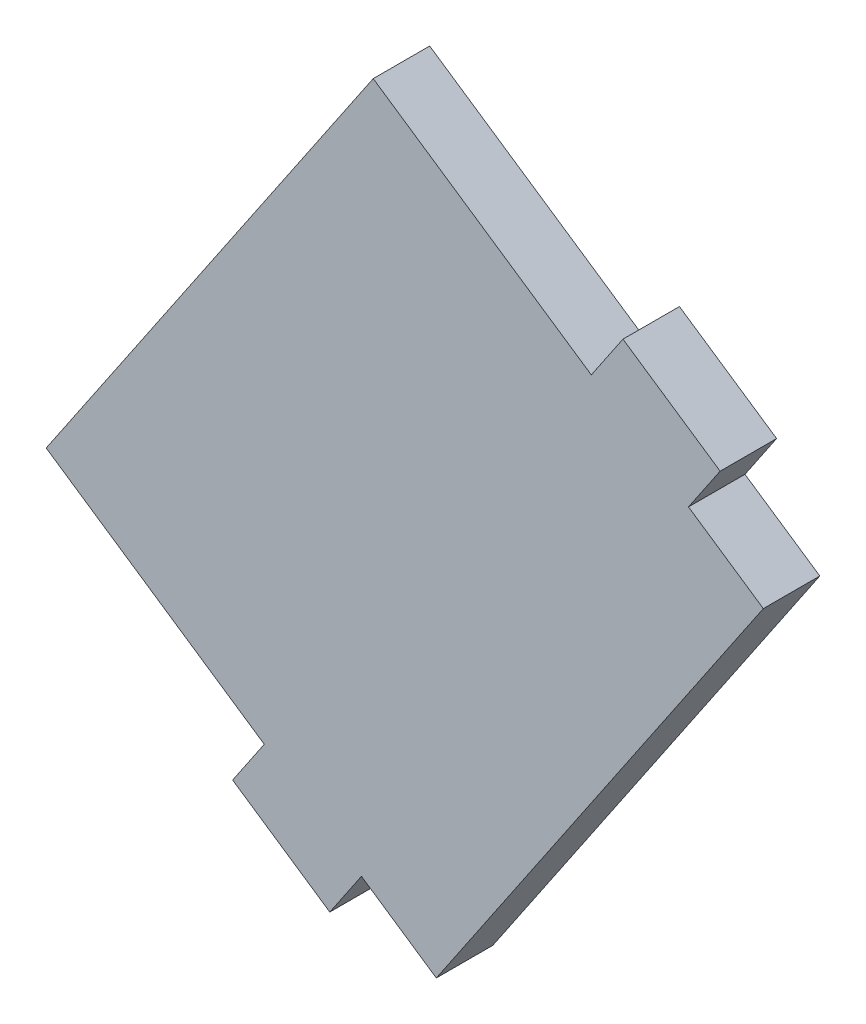
ISO-10303-21;
HEADER;
FILE_DESCRIPTION(('STEP AP214'),'2;1');
FILE_NAME('part.step','',(''),(''),'','','');
FILE_SCHEMA(('AUTOMOTIVE_DESIGN { 1 0 10303 214 1 1 1 1 }'));
ENDSEC;
DATA;
#1=APPLICATION_CONTEXT('core data for automotive mechanical design processes');
#2=APPLICATION_PROTOCOL_DEFINITION('international standard','automotive_design',2000,#1);
#3=PRODUCT_CONTEXT('',#1,'mechanical');
#4=PRODUCT('Part','Part','',(#3));
#5=PRODUCT_RELATED_PRODUCT_CATEGORY('part','',(#4));
#6=PRODUCT_DEFINITION_FORMATION('','',#4);
#7=PRODUCT_DEFINITION_CONTEXT('part definition',#1,'design');
#8=PRODUCT_DEFINITION('design','',#6,#7);
#9=PRODUCT_DEFINITION_SHAPE('','',#8);
#10=(LENGTH_UNIT() NAMED_UNIT(*) SI_UNIT(.MILLI.,.METRE.));
#11=(NAMED_UNIT(*) PLANE_ANGLE_UNIT() SI_UNIT($,.RADIAN.));
#12=(NAMED_UNIT(*) SI_UNIT($,.STERADIAN.) SOLID_ANGLE_UNIT());
#13=UNCERTAINTY_MEASURE_WITH_UNIT(LENGTH_MEASURE(1.E-05),#10,'distance_accuracy_value','');
#14=(GEOMETRIC_REPRESENTATION_CONTEXT(3) GLOBAL_UNCERTAINTY_ASSIGNED_CONTEXT((#13)) GLOBAL_UNIT_ASSIGNED_CONTEXT((#10,
#11,#12)) REPRESENTATION_CONTEXT('',''));
#15=CARTESIAN_POINT('',(0.,0.,0.));
#16=DIRECTION('',(0.,0.,1.));
#17=DIRECTION('',(1.,0.,0.));
#18=AXIS2_PLACEMENT_3D('',#15,#16,#17);
#19=CARTESIAN_POINT('',(608.465137012589,469.123984311673,2.99999999999999));
#20=DIRECTION('',(0.560321142221677,0.828275447891216,0.));
#21=DIRECTION('',(-0.828275447891216,0.560321142221677,0.));
#22=AXIS2_PLACEMENT_3D('',#19,#20,#21);
#23=PLANE('',#22);
#24=DIRECTION('',(0.828275447891216,-0.560321142221677,0.));
#25=VECTOR('',#24,1.);
#26=CARTESIAN_POINT('',(608.465137012589,469.123984311673,0.));
#27=LINE('',#26,#25);
#28=CARTESIAN_POINT('',(596.881202269416,476.960415493161,0.));
#29=VERTEX_POINT('',#28);
#30=CARTESIAN_POINT('',(608.465137012589,469.123984311673,0.));
#31=VERTEX_POINT('',#30);
#32=EDGE_CURVE('E124',#29,#31,#27,.T.);
#33=ORIENTED_EDGE('',*,*,#32,.T.);
#34=DIRECTION('',(0.,0.,-0.999999999999999));
#35=VECTOR('',#34,1.);
#36=CARTESIAN_POINT('',(608.465137012589,469.123984311673,2.99999999999999));
#37=LINE('',#36,#35);
#38=CARTESIAN_POINT('',(608.465137012589,469.123984311673,2.99999999999999));
#39=VERTEX_POINT('',#38);
#40=EDGE_CURVE('E11',#39,#31,#37,.T.);
#41=ORIENTED_EDGE('',*,*,#40,.F.);
#42=DIRECTION('',(0.828275447891216,-0.560321142221677,0.));
#43=VECTOR('',#42,1.);
#44=CARTESIAN_POINT('',(608.465137012589,469.123984311673,2.99999999999999));
#45=LINE('',#44,#43);
#46=CARTESIAN_POINT('',(596.881202269416,476.960415493161,3.00000000000001));
#47=VERTEX_POINT('',#46);
#48=EDGE_CURVE('E159',#47,#39,#45,.T.);
#49=ORIENTED_EDGE('',*,*,#48,.F.);
#50=DIRECTION('',(0.,0.,-0.999999999999999));
#51=VECTOR('',#50,1.);
#52=CARTESIAN_POINT('',(596.881202269416,476.960415493161,3.00000000000001));
#53=LINE('',#52,#51);
#54=EDGE_CURVE('E137',#47,#29,#53,.T.);
#55=ORIENTED_EDGE('',*,*,#54,.T.);
#56=EDGE_LOOP('',(#33,#41,#49,#55));
#57=FACE_BOUND('',#56,.T.);
#58=ADVANCED_FACE('F32',(#57),#23,.F.);
#59=CARTESIAN_POINT('',(606.784173585924,466.639157968,3.00000000000004));
#60=DIRECTION('',(0.8282754478912,-0.5603211422217,0.));
#61=DIRECTION('',(0.560321142221701,0.8282754478912,0.));
#62=AXIS2_PLACEMENT_3D('',#59,#60,#61);
#63=PLANE('',#62);
#64=DIRECTION('',(-0.560321142221701,-0.8282754478912,0.));
#65=VECTOR('',#64,1.);
#66=CARTESIAN_POINT('',(606.784173585924,466.639157968,0.));
#67=LINE('',#66,#65);
#68=CARTESIAN_POINT('',(606.784173585924,466.639157968,0.));
#69=VERTEX_POINT('',#68);
#70=EDGE_CURVE('E120',#31,#69,#67,.T.);
#71=ORIENTED_EDGE('',*,*,#70,.T.);
#72=DIRECTION('',(0.,0.,-0.999999999999999));
#73=VECTOR('',#72,1.);
#74=CARTESIAN_POINT('',(606.784173585924,466.639157968,3.00000000000004));
#75=LINE('',#74,#73);
#76=CARTESIAN_POINT('',(606.784173585924,466.639157968,3.00000000000004));
#77=VERTEX_POINT('',#76);
#78=EDGE_CURVE('E39',#77,#69,#75,.T.);
#79=ORIENTED_EDGE('',*,*,#78,.F.);
#80=DIRECTION('',(-0.560321142221701,-0.8282754478912,0.));
#81=VECTOR('',#80,1.);
#82=CARTESIAN_POINT('',(606.784173585924,466.639157968,3.00000000000004));
#83=LINE('',#82,#81);
#84=EDGE_CURVE('E133',#39,#77,#83,.T.);
#85=ORIENTED_EDGE('',*,*,#84,.F.);
#86=ORIENTED_EDGE('',*,*,#40,.T.);
#87=EDGE_LOOP('',(#71,#79,#85,#86));
#88=FACE_BOUND('',#87,.T.);
#89=ADVANCED_FACE('F132',(#88),#63,.F.);
#90=CARTESIAN_POINT('',(611.94582613428,463.147344877307,3.00000000000004));
#91=DIRECTION('',(0.56032114222167,0.828275447891221,0.));
#92=DIRECTION('',(-0.828275447891221,0.56032114222167,0.));
#93=AXIS2_PLACEMENT_3D('',#90,#91,#92);
#94=PLANE('',#93);
#95=DIRECTION('',(0.828275447891221,-0.560321142221669,0.));
#96=VECTOR('',#95,1.);
#97=CARTESIAN_POINT('',(611.94582613428,463.147344877307,0.));
#98=LINE('',#97,#96);
#99=CARTESIAN_POINT('',(611.94582613428,463.147344877307,0.));
#100=VERTEX_POINT('',#99);
#101=EDGE_CURVE('E126',#69,#100,#98,.T.);
#102=ORIENTED_EDGE('',*,*,#101,.T.);
#103=DIRECTION('',(0.,0.,-0.999999999999999));
#104=VECTOR('',#103,1.);
#105=CARTESIAN_POINT('',(611.94582613428,463.147344877307,3.00000000000004));
#106=LINE('',#105,#104);
#107=CARTESIAN_POINT('',(611.94582613428,463.147344877307,3.00000000000004));
#108=VERTEX_POINT('',#107);
#109=EDGE_CURVE('E205',#108,#100,#106,.T.);
#110=ORIENTED_EDGE('',*,*,#109,.F.);
#111=DIRECTION('',(0.828275447891221,-0.560321142221669,0.));
#112=VECTOR('',#111,1.);
#113=CARTESIAN_POINT('',(611.94582613428,463.147344877307,3.00000000000004));
#114=LINE('',#113,#112);
#115=EDGE_CURVE('E162',#77,#108,#114,.T.);
#116=ORIENTED_EDGE('',*,*,#115,.F.);
#117=ORIENTED_EDGE('',*,*,#78,.T.);
#118=EDGE_LOOP('',(#102,#110,#116,#117));
#119=FACE_BOUND('',#118,.T.);
#120=ADVANCED_FACE('F209',(#119),#94,.F.);
#121=CARTESIAN_POINT('',(611.94582613428,463.147344877307,3.00000000000004));
#122=DIRECTION('',(-0.828275447891206,0.560321142221692,0.));
#123=DIRECTION('',(-0.560321142221693,-0.828275447891205,0.));
#124=AXIS2_PLACEMENT_3D('',#121,#122,#123);
#125=PLANE('',#124);
#126=DIRECTION('',(0.560321142221692,0.828275447891205,0.));
#127=VECTOR('',#126,1.);
#128=CARTESIAN_POINT('',(611.94582613428,463.147344877307,0.));
#129=LINE('',#128,#127);
#130=CARTESIAN_POINT('',(613.626789560945,465.63217122098,0.));
#131=VERTEX_POINT('',#130);
#132=EDGE_CURVE('E141',#100,#131,#129,.T.);
#133=ORIENTED_EDGE('',*,*,#132,.T.);
#134=DIRECTION('',(0.,0.,-0.999999999999999));
#135=VECTOR('',#134,1.);
#136=CARTESIAN_POINT('',(613.626789560945,465.63217122098,2.99999999999999));
#137=LINE('',#136,#135);
#138=CARTESIAN_POINT('',(613.626789560945,465.63217122098,2.99999999999999));
#139=VERTEX_POINT('',#138);
#140=EDGE_CURVE('E202',#139,#131,#137,.T.);
#141=ORIENTED_EDGE('',*,*,#140,.F.);
#142=DIRECTION('',(0.560321142221692,0.828275447891205,0.));
#143=VECTOR('',#142,1.);
#144=CARTESIAN_POINT('',(611.94582613428,463.147344877307,3.00000000000004));
#145=LINE('',#144,#143);
#146=EDGE_CURVE('E164',#108,#139,#145,.T.);
#147=ORIENTED_EDGE('',*,*,#146,.F.);
#148=ORIENTED_EDGE('',*,*,#109,.T.);
#149=EDGE_LOOP('',(#133,#141,#147,#148));
#150=FACE_BOUND('',#149,.T.);
#151=ADVANCED_FACE('F217',(#150),#125,.F.);
#152=CARTESIAN_POINT('',(617.602511710822,462.942629738316,2.99999999999991));
#153=DIRECTION('',(0.560321142221693,0.828275447891205,0.));
#154=DIRECTION('',(-0.828275447891206,0.560321142221693,0.));
#155=AXIS2_PLACEMENT_3D('',#152,#153,#154);
#156=PLANE('',#155);
#157=DIRECTION('',(0.828275447891205,-0.560321142221693,0.));
#158=VECTOR('',#157,1.);
#159=CARTESIAN_POINT('',(617.602511710823,462.942629738316,0.));
#160=LINE('',#159,#158);
#161=CARTESIAN_POINT('',(617.602511710823,462.942629738316,0.));
#162=VERTEX_POINT('',#161);
#163=EDGE_CURVE('E143',#131,#162,#160,.T.);
#164=ORIENTED_EDGE('',*,*,#163,.T.);
#165=DIRECTION('',(0.,0.,-0.999999999999999));
#166=VECTOR('',#165,1.);
#167=CARTESIAN_POINT('',(617.602511710822,462.942629738316,2.99999999999991));
#168=LINE('',#167,#166);
#169=CARTESIAN_POINT('',(617.602511710822,462.942629738316,2.99999999999991));
#170=VERTEX_POINT('',#169);
#171=EDGE_CURVE('E199',#170,#162,#168,.T.);
#172=ORIENTED_EDGE('',*,*,#171,.F.);
#173=DIRECTION('',(0.828275447891205,-0.560321142221693,0.));
#174=VECTOR('',#173,1.);
#175=CARTESIAN_POINT('',(617.602511710822,462.942629738316,2.99999999999991));
#176=LINE('',#175,#174);
#177=EDGE_CURVE('E166',#139,#170,#176,.T.);
#178=ORIENTED_EDGE('',*,*,#177,.F.);
#179=ORIENTED_EDGE('',*,*,#140,.T.);
#180=EDGE_LOOP('',(#164,#172,#178,#179));
#181=FACE_BOUND('',#180,.T.);
#182=ADVANCED_FACE('F220',(#181),#156,.F.);
#183=CARTESIAN_POINT('',(617.602511710822,462.942629738316,2.99999999999991));
#184=DIRECTION('',(-0.828275447891213,0.560321142221682,0.));
#185=DIRECTION('',(-0.560321142221682,-0.828275447891212,0.));
#186=AXIS2_PLACEMENT_3D('',#183,#184,#185);
#187=PLANE('',#186);
#188=DIRECTION('',(0.560321142221682,0.828275447891212,0.));
#189=VECTOR('',#188,1.);
#190=CARTESIAN_POINT('',(617.602511710823,462.942629738316,0.));
#191=LINE('',#190,#189);
#192=CARTESIAN_POINT('',(634.972467119695,488.619168622943,0.));
#193=VERTEX_POINT('',#192);
#194=EDGE_CURVE('E145',#162,#193,#191,.T.);
#195=ORIENTED_EDGE('',*,*,#194,.T.);
#196=DIRECTION('',(0.,0.,-0.999999999999999));
#197=VECTOR('',#196,1.);
#198=CARTESIAN_POINT('',(634.972467119695,488.619168622943,3.));
#199=LINE('',#198,#197);
#200=CARTESIAN_POINT('',(634.972467119695,488.619168622943,3.));
#201=VERTEX_POINT('',#200);
#202=EDGE_CURVE('E196',#201,#193,#199,.T.);
#203=ORIENTED_EDGE('',*,*,#202,.F.);
#204=DIRECTION('',(0.560321142221682,0.828275447891212,0.));
#205=VECTOR('',#204,1.);
#206=CARTESIAN_POINT('',(617.602511710822,462.942629738316,2.99999999999991));
#207=LINE('',#206,#205);
#208=EDGE_CURVE('E168',#170,#201,#207,.T.);
#209=ORIENTED_EDGE('',*,*,#208,.F.);
#210=ORIENTED_EDGE('',*,*,#171,.T.);
#211=EDGE_LOOP('',(#195,#203,#209,#210));
#212=FACE_BOUND('',#211,.T.);
#213=ADVANCED_FACE('F225',(#212),#187,.F.);
#214=CARTESIAN_POINT('',(634.972467119695,488.619168622943,3.));
#215=DIRECTION('',(-0.560321142221675,-0.828275447891217,0.));
#216=DIRECTION('',(0.828275447891218,-0.560321142221674,0.));
#217=AXIS2_PLACEMENT_3D('',#214,#215,#216);
#218=PLANE('',#217);
#219=DIRECTION('',(-0.828275447891218,0.560321142221674,0.));
#220=VECTOR('',#219,1.);
#221=CARTESIAN_POINT('',(634.972467119695,488.619168622943,0.));
#222=LINE('',#221,#220);
#223=CARTESIAN_POINT('',(630.996744969817,491.308710105608,0.));
#224=VERTEX_POINT('',#223);
#225=EDGE_CURVE('E147',#193,#224,#222,.T.);
#226=ORIENTED_EDGE('',*,*,#225,.T.);
#227=DIRECTION('',(0.,0.,-0.999999999999999));
#228=VECTOR('',#227,1.);
#229=CARTESIAN_POINT('',(630.996744969817,491.308710105607,2.99999999999998));
#230=LINE('',#229,#228);
#231=CARTESIAN_POINT('',(630.996744969817,491.308710105607,2.99999999999998));
#232=VERTEX_POINT('',#231);
#233=EDGE_CURVE('E193',#232,#224,#230,.T.);
#234=ORIENTED_EDGE('',*,*,#233,.F.);
#235=DIRECTION('',(-0.828275447891218,0.560321142221674,0.));
#236=VECTOR('',#235,1.);
#237=CARTESIAN_POINT('',(634.972467119695,488.619168622943,3.));
#238=LINE('',#237,#236);
#239=EDGE_CURVE('E170',#201,#232,#238,.T.);
#240=ORIENTED_EDGE('',*,*,#239,.F.);
#241=ORIENTED_EDGE('',*,*,#202,.T.);
#242=EDGE_LOOP('',(#226,#234,#240,#241));
#243=FACE_BOUND('',#242,.T.);
#244=ADVANCED_FACE('F231',(#243),#218,.F.);
#245=CARTESIAN_POINT('',(630.996744969817,491.308710105607,2.99999999999998));
#246=DIRECTION('',(-0.828275447891235,0.560321142221649,0.));
#247=DIRECTION('',(-0.560321142221649,-0.828275447891235,0.));
#248=AXIS2_PLACEMENT_3D('',#245,#246,#247);
#249=PLANE('',#248);
#250=DIRECTION('',(0.560321142221649,0.828275447891235,0.));
#251=VECTOR('',#250,1.);
#252=CARTESIAN_POINT('',(630.996744969817,491.308710105608,0.));
#253=LINE('',#252,#251);
#254=CARTESIAN_POINT('',(632.677708396482,493.793536449281,0.));
#255=VERTEX_POINT('',#254);
#256=EDGE_CURVE('E149',#224,#255,#253,.T.);
#257=ORIENTED_EDGE('',*,*,#256,.T.);
#258=DIRECTION('',(0.,0.,-0.999999999999999));
#259=VECTOR('',#258,1.);
#260=CARTESIAN_POINT('',(632.677708396482,493.793536449281,3.));
#261=LINE('',#260,#259);
#262=CARTESIAN_POINT('',(632.677708396482,493.793536449281,3.));
#263=VERTEX_POINT('',#262);
#264=EDGE_CURVE('E190',#263,#255,#261,.T.);
#265=ORIENTED_EDGE('',*,*,#264,.F.);
#266=DIRECTION('',(0.560321142221649,0.828275447891235,0.));
#267=VECTOR('',#266,1.);
#268=CARTESIAN_POINT('',(630.996744969817,491.308710105607,2.99999999999998));
#269=LINE('',#268,#267);
#270=EDGE_CURVE('E172',#232,#263,#269,.T.);
#271=ORIENTED_EDGE('',*,*,#270,.F.);
#272=ORIENTED_EDGE('',*,*,#233,.T.);
#273=EDGE_LOOP('',(#257,#265,#271,#272));
#274=FACE_BOUND('',#273,.T.);
#275=ADVANCED_FACE('F235',(#274),#249,.F.);
#276=CARTESIAN_POINT('',(632.677708396482,493.793536449281,3.));
#277=DIRECTION('',(-0.56032114222168,-0.828275447891213,0.));
#278=DIRECTION('',(0.828275447891214,-0.56032114222168,0.));
#279=AXIS2_PLACEMENT_3D('',#276,#277,#278);
#280=PLANE('',#279);
#281=DIRECTION('',(-0.828275447891214,0.56032114222168,0.));
#282=VECTOR('',#281,1.);
#283=CARTESIAN_POINT('',(632.677708396482,493.793536449281,0.));
#284=LINE('',#283,#282);
#285=CARTESIAN_POINT('',(627.516055848126,497.285349539974,0.));
#286=VERTEX_POINT('',#285);
#287=EDGE_CURVE('E151',#255,#286,#284,.T.);
#288=ORIENTED_EDGE('',*,*,#287,.T.);
#289=DIRECTION('',(0.,0.,-0.999999999999999));
#290=VECTOR('',#289,1.);
#291=CARTESIAN_POINT('',(627.516055848126,497.285349539974,2.99999999999998));
#292=LINE('',#291,#290);
#293=CARTESIAN_POINT('',(627.516055848126,497.285349539974,2.99999999999998));
#294=VERTEX_POINT('',#293);
#295=EDGE_CURVE('E187',#294,#286,#292,.T.);
#296=ORIENTED_EDGE('',*,*,#295,.F.);
#297=DIRECTION('',(-0.828275447891214,0.56032114222168,0.));
#298=VECTOR('',#297,1.);
#299=CARTESIAN_POINT('',(632.677708396482,493.793536449281,3.));
#300=LINE('',#299,#298);
#301=EDGE_CURVE('E174',#263,#294,#300,.T.);
#302=ORIENTED_EDGE('',*,*,#301,.F.);
#303=ORIENTED_EDGE('',*,*,#264,.T.);
#304=EDGE_LOOP('',(#288,#296,#302,#303));
#305=FACE_BOUND('',#304,.T.);
#306=ADVANCED_FACE('F240',(#305),#280,.F.);
#307=CARTESIAN_POINT('',(625.835092421461,494.800523196301,3.));
#308=DIRECTION('',(0.828275447891183,-0.560321142221725,0.));
#309=DIRECTION('',(0.560321142221726,0.828275447891183,0.));
#310=AXIS2_PLACEMENT_3D('',#307,#308,#309);
#311=PLANE('',#310);
#312=DIRECTION('',(-0.560321142221726,-0.828275447891183,0.));
#313=VECTOR('',#312,1.);
#314=CARTESIAN_POINT('',(625.835092421461,494.800523196301,0.));
#315=LINE('',#314,#313);
#316=CARTESIAN_POINT('',(625.835092421461,494.800523196301,0.));
#317=VERTEX_POINT('',#316);
#318=EDGE_CURVE('E153',#286,#317,#315,.T.);
#319=ORIENTED_EDGE('',*,*,#318,.T.);
#320=DIRECTION('',(0.,0.,-0.999999999999999));
#321=VECTOR('',#320,1.);
#322=CARTESIAN_POINT('',(625.835092421461,494.800523196301,3.));
#323=LINE('',#322,#321);
#324=CARTESIAN_POINT('',(625.835092421461,494.800523196301,3.));
#325=VERTEX_POINT('',#324);
#326=EDGE_CURVE('E184',#325,#317,#323,.T.);
#327=ORIENTED_EDGE('',*,*,#326,.F.);
#328=DIRECTION('',(-0.560321142221726,-0.828275447891183,0.));
#329=VECTOR('',#328,1.);
#330=CARTESIAN_POINT('',(625.835092421461,494.800523196301,3.));
#331=LINE('',#330,#329);
#332=EDGE_CURVE('E176',#294,#325,#331,.T.);
#333=ORIENTED_EDGE('',*,*,#332,.F.);
#334=ORIENTED_EDGE('',*,*,#295,.T.);
#335=EDGE_LOOP('',(#319,#327,#333,#334));
#336=FACE_BOUND('',#335,.T.);
#337=ADVANCED_FACE('F244',(#336),#311,.F.);
#338=CARTESIAN_POINT('',(625.835092421461,494.800523196301,3.));
#339=DIRECTION('',(-0.560321142221684,-0.828275447891211,0.));
#340=DIRECTION('',(0.828275447891211,-0.560321142221684,0.));
#341=AXIS2_PLACEMENT_3D('',#338,#339,#340);
#342=PLANE('',#341);
#343=DIRECTION('',(-0.828275447891211,0.560321142221684,0.));
#344=VECTOR('',#343,1.);
#345=CARTESIAN_POINT('',(625.835092421461,494.800523196301,0.));
#346=LINE('',#345,#344);
#347=CARTESIAN_POINT('',(614.251157678288,502.636954377789,0.));
#348=VERTEX_POINT('',#347);
#349=EDGE_CURVE('E155',#317,#348,#346,.T.);
#350=ORIENTED_EDGE('',*,*,#349,.T.);
#351=DIRECTION('',(0.,0.,-0.999999999999999));
#352=VECTOR('',#351,1.);
#353=CARTESIAN_POINT('',(614.251157678288,502.636954377789,2.99999999999992));
#354=LINE('',#353,#352);
#355=CARTESIAN_POINT('',(614.251157678288,502.636954377789,2.99999999999992));
#356=VERTEX_POINT('',#355);
#357=EDGE_CURVE('E181',#356,#348,#354,.T.);
#358=ORIENTED_EDGE('',*,*,#357,.F.);
#359=DIRECTION('',(-0.828275447891211,0.560321142221684,0.));
#360=VECTOR('',#359,1.);
#361=CARTESIAN_POINT('',(625.835092421461,494.800523196301,3.));
#362=LINE('',#361,#360);
#363=EDGE_CURVE('E51',#325,#356,#362,.T.);
#364=ORIENTED_EDGE('',*,*,#363,.F.);
#365=ORIENTED_EDGE('',*,*,#326,.T.);
#366=EDGE_LOOP('',(#350,#358,#364,#365));
#367=FACE_BOUND('',#366,.T.);
#368=ADVANCED_FACE('F248',(#367),#342,.F.);
#369=CARTESIAN_POINT('',(596.881202269416,476.960415493161,3.00000000000001));
#370=DIRECTION('',(0.828275447891212,-0.560321142221683,0.));
#371=DIRECTION('',(0.560321142221683,0.828275447891212,0.));
#372=AXIS2_PLACEMENT_3D('',#369,#370,#371);
#373=PLANE('',#372);
#374=DIRECTION('',(-0.560321142221683,-0.828275447891211,0.));
#375=VECTOR('',#374,1.);
#376=CARTESIAN_POINT('',(596.881202269416,476.960415493161,0.));
#377=LINE('',#376,#375);
#378=EDGE_CURVE('E157',#348,#29,#377,.T.);
#379=ORIENTED_EDGE('',*,*,#378,.T.);
#380=ORIENTED_EDGE('',*,*,#54,.F.);
#381=DIRECTION('',(-0.560321142221683,-0.828275447891211,0.));
#382=VECTOR('',#381,1.);
#383=CARTESIAN_POINT('',(596.881202269416,476.960415493161,3.00000000000001));
#384=LINE('',#383,#382);
#385=EDGE_CURVE('E46',#356,#47,#384,.T.);
#386=ORIENTED_EDGE('',*,*,#385,.F.);
#387=ORIENTED_EDGE('',*,*,#357,.T.);
#388=EDGE_LOOP('',(#379,#380,#386,#387));
#389=FACE_BOUND('',#388,.T.);
#390=ADVANCED_FACE('F250',(#389),#373,.F.);
#391=CARTESIAN_POINT('',(617.602511710823,462.942629738316,2.99999999999995));
#392=DIRECTION('',(0.,0.,-0.999999999999999));
#393=DIRECTION('',(-1.,0.,0.));
#394=AXIS2_PLACEMENT_3D('',#391,#392,#393);
#395=PLANE('',#394);
#396=ORIENTED_EDGE('',*,*,#48,.T.);
#397=ORIENTED_EDGE('',*,*,#84,.T.);
#398=ORIENTED_EDGE('',*,*,#115,.T.);
#399=ORIENTED_EDGE('',*,*,#146,.T.);
#400=ORIENTED_EDGE('',*,*,#177,.T.);
#401=ORIENTED_EDGE('',*,*,#208,.T.);
#402=ORIENTED_EDGE('',*,*,#239,.T.);
#403=ORIENTED_EDGE('',*,*,#270,.T.);
#404=ORIENTED_EDGE('',*,*,#301,.T.);
#405=ORIENTED_EDGE('',*,*,#332,.T.);
#406=ORIENTED_EDGE('',*,*,#363,.T.);
#407=ORIENTED_EDGE('',*,*,#385,.T.);
#408=EDGE_LOOP('',(#396,#397,#398,#399,#400,#401,#402,#403,#404,#405,#406,#407));
#409=FACE_BOUND('',#408,.T.);
#410=ADVANCED_FACE('F212',(#409),#395,.F.);
#411=CARTESIAN_POINT('',(617.602511710822,462.942629738316,0.));
#412=DIRECTION('',(0.,0.,-0.999999999999999));
#413=DIRECTION('',(-1.,0.,0.));
#414=AXIS2_PLACEMENT_3D('',#411,#412,#413);
#415=PLANE('',#414);
#416=ORIENTED_EDGE('',*,*,#32,.F.);
#417=ORIENTED_EDGE('',*,*,#378,.F.);
#418=ORIENTED_EDGE('',*,*,#349,.F.);
#419=ORIENTED_EDGE('',*,*,#318,.F.);
#420=ORIENTED_EDGE('',*,*,#287,.F.);
#421=ORIENTED_EDGE('',*,*,#256,.F.);
#422=ORIENTED_EDGE('',*,*,#225,.F.);
#423=ORIENTED_EDGE('',*,*,#194,.F.);
#424=ORIENTED_EDGE('',*,*,#163,.F.);
#425=ORIENTED_EDGE('',*,*,#132,.F.);
#426=ORIENTED_EDGE('',*,*,#101,.F.);
#427=ORIENTED_EDGE('',*,*,#70,.F.);
#428=EDGE_LOOP('',(#416,#417,#418,#419,#420,#421,#422,#423,#424,#425,#426,#427));
#429=FACE_BOUND('',#428,.T.);
#430=ADVANCED_FACE('F121',(#429),#415,.T.);
#431=CLOSED_SHELL('',(#58,#89,#120,#151,#182,#213,#244,#275,#306,#337,#368,#390,#410,#430));
#432=MANIFOLD_SOLID_BREP('B2',#431);
#433=ADVANCED_BREP_SHAPE_REPRESENTATION('',(#18,#432),#14);
#434=SHAPE_DEFINITION_REPRESENTATION(#9,#433);
ENDSEC;
END-ISO-10303-21;
